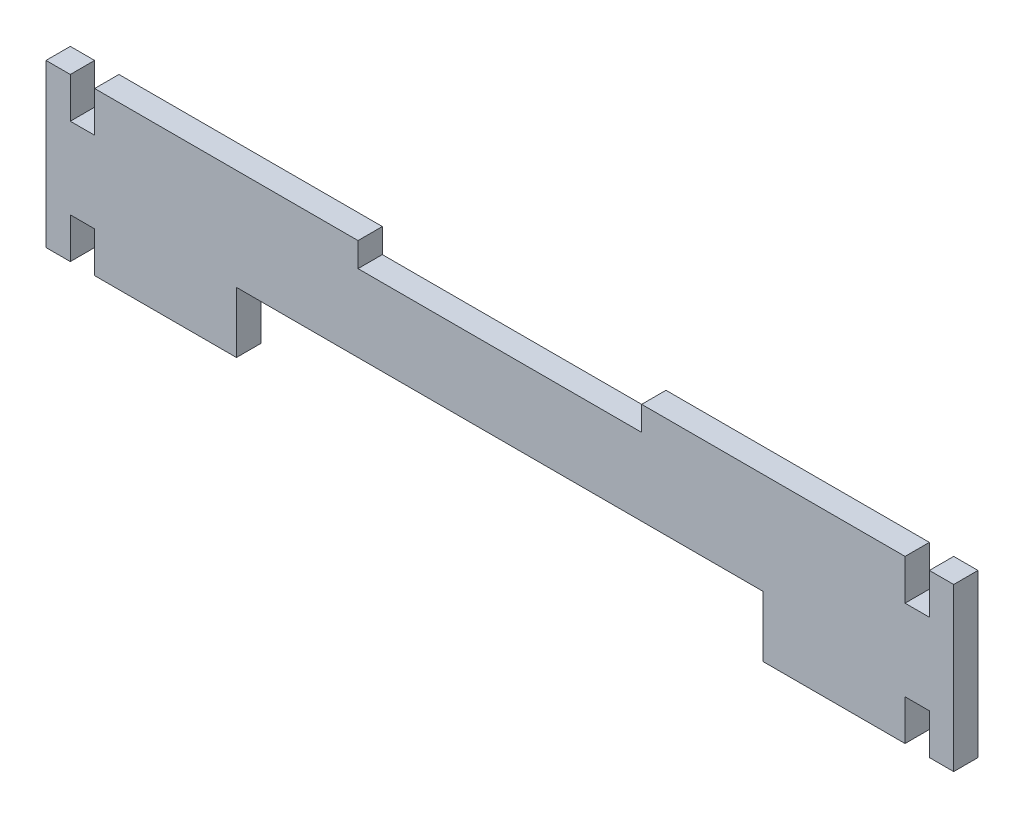
ISO-10303-21;
HEADER;
FILE_DESCRIPTION(('STEP AP214'),'2;1');
FILE_NAME('part.step','',(''),(''),'','','');
FILE_SCHEMA(('AUTOMOTIVE_DESIGN { 1 0 10303 214 1 1 1 1 }'));
ENDSEC;
DATA;
#1=APPLICATION_CONTEXT('core data for automotive mechanical design processes');
#2=APPLICATION_PROTOCOL_DEFINITION('international standard','automotive_design',2000,#1);
#3=PRODUCT_CONTEXT('',#1,'mechanical');
#4=PRODUCT('Part','Part','',(#3));
#5=PRODUCT_RELATED_PRODUCT_CATEGORY('part','',(#4));
#6=PRODUCT_DEFINITION_FORMATION('','',#4);
#7=PRODUCT_DEFINITION_CONTEXT('part definition',#1,'design');
#8=PRODUCT_DEFINITION('design','',#6,#7);
#9=PRODUCT_DEFINITION_SHAPE('','',#8);
#10=(LENGTH_UNIT() NAMED_UNIT(*) SI_UNIT(.MILLI.,.METRE.));
#11=(NAMED_UNIT(*) PLANE_ANGLE_UNIT() SI_UNIT($,.RADIAN.));
#12=(NAMED_UNIT(*) SI_UNIT($,.STERADIAN.) SOLID_ANGLE_UNIT());
#13=UNCERTAINTY_MEASURE_WITH_UNIT(LENGTH_MEASURE(1.E-05),#10,'distance_accuracy_value','');
#14=(GEOMETRIC_REPRESENTATION_CONTEXT(3) GLOBAL_UNCERTAINTY_ASSIGNED_CONTEXT((#13)) GLOBAL_UNIT_ASSIGNED_CONTEXT((#10,
#11,#12)) REPRESENTATION_CONTEXT('',''));
#15=CARTESIAN_POINT('',(0.,0.,0.));
#16=DIRECTION('',(0.,0.,1.));
#17=DIRECTION('',(1.,0.,0.));
#18=AXIS2_PLACEMENT_3D('',#15,#16,#17);
#19=CARTESIAN_POINT('',(0.,0.,6.));
#20=DIRECTION('',(0.,1.,0.));
#21=DIRECTION('',(-1.,0.,0.));
#22=AXIS2_PLACEMENT_3D('',#19,#20,#21);
#23=PLANE('',#22);
#24=DIRECTION('',(1.,0.,0.));
#25=VECTOR('',#24,1.);
#26=CARTESIAN_POINT('',(0.,0.,0.));
#27=LINE('',#26,#25);
#28=CARTESIAN_POINT('',(-212.,0.,0.));
#29=VERTEX_POINT('',#28);
#30=CARTESIAN_POINT('',(-177.,0.,0.));
#31=VERTEX_POINT('',#30);
#32=EDGE_CURVE('E249',#29,#31,#27,.T.);
#33=ORIENTED_EDGE('',*,*,#32,.T.);
#34=DIRECTION('',(0.,0.,1.));
#35=VECTOR('',#34,1.);
#36=CARTESIAN_POINT('',(-177.,0.,-4.));
#37=LINE('',#36,#35);
#38=CARTESIAN_POINT('',(-177.,0.,6.));
#39=VERTEX_POINT('',#38);
#40=EDGE_CURVE('E233',#31,#39,#37,.T.);
#41=ORIENTED_EDGE('',*,*,#40,.T.);
#42=DIRECTION('',(1.,0.,0.));
#43=VECTOR('',#42,1.);
#44=CARTESIAN_POINT('',(0.,0.,6.));
#45=LINE('',#44,#43);
#46=CARTESIAN_POINT('',(-212.,0.,6.));
#47=VERTEX_POINT('',#46);
#48=EDGE_CURVE('E247',#47,#39,#45,.T.);
#49=ORIENTED_EDGE('',*,*,#48,.F.);
#50=DIRECTION('',(0.,0.,1.));
#51=VECTOR('',#50,1.);
#52=CARTESIAN_POINT('',(-212.,0.,0.));
#53=LINE('',#52,#51);
#54=EDGE_CURVE('E409',#29,#47,#53,.T.);
#55=ORIENTED_EDGE('',*,*,#54,.F.);
#56=EDGE_LOOP('',(#33,#41,#49,#55));
#57=FACE_BOUND('',#56,.T.);
#58=ADVANCED_FACE('F45',(#57),#23,.F.);
#59=CARTESIAN_POINT('',(0.,40.,6.));
#60=DIRECTION('',(0.,-1.,0.));
#61=DIRECTION('',(1.,0.,0.));
#62=AXIS2_PLACEMENT_3D('',#59,#60,#61);
#63=PLANE('',#62);
#64=DIRECTION('',(-1.,0.,0.));
#65=VECTOR('',#64,1.);
#66=CARTESIAN_POINT('',(0.,40.,6.));
#67=LINE('',#66,#65);
#68=CARTESIAN_POINT('',(-147.,40.,6.));
#69=VERTEX_POINT('',#68);
#70=CARTESIAN_POINT('',(-212.,40.,6.));
#71=VERTEX_POINT('',#70);
#72=EDGE_CURVE('E284',#69,#71,#67,.T.);
#73=ORIENTED_EDGE('',*,*,#72,.F.);
#74=DIRECTION('',(0.,0.,1.));
#75=VECTOR('',#74,1.);
#76=CARTESIAN_POINT('',(-147.,40.,0.));
#77=LINE('',#76,#75);
#78=CARTESIAN_POINT('',(-147.,40.,0.));
#79=VERTEX_POINT('',#78);
#80=EDGE_CURVE('E358',#79,#69,#77,.T.);
#81=ORIENTED_EDGE('',*,*,#80,.F.);
#82=DIRECTION('',(-1.,0.,0.));
#83=VECTOR('',#82,1.);
#84=CARTESIAN_POINT('',(0.,40.,0.));
#85=LINE('',#84,#83);
#86=CARTESIAN_POINT('',(-212.,40.,0.));
#87=VERTEX_POINT('',#86);
#88=EDGE_CURVE('E522',#79,#87,#85,.T.);
#89=ORIENTED_EDGE('',*,*,#88,.T.);
#90=DIRECTION('',(0.,0.,1.));
#91=VECTOR('',#90,1.);
#92=CARTESIAN_POINT('',(-212.,40.,0.));
#93=LINE('',#92,#91);
#94=EDGE_CURVE('E298',#87,#71,#93,.T.);
#95=ORIENTED_EDGE('',*,*,#94,.T.);
#96=EDGE_LOOP('',(#73,#81,#89,#95));
#97=FACE_BOUND('',#96,.T.);
#98=ADVANCED_FACE('F609',(#97),#63,.F.);
#99=CARTESIAN_POINT('',(-12.,40.,0.));
#100=VERTEX_POINT('',#99);
#101=CARTESIAN_POINT('',(-77.,40.,0.));
#102=VERTEX_POINT('',#101);
#103=EDGE_CURVE('E521',#100,#102,#85,.T.);
#104=ORIENTED_EDGE('',*,*,#103,.T.);
#105=DIRECTION('',(0.,0.,1.));
#106=VECTOR('',#105,1.);
#107=CARTESIAN_POINT('',(-77.,40.,0.));
#108=LINE('',#107,#106);
#109=CARTESIAN_POINT('',(-77.,40.,6.));
#110=VERTEX_POINT('',#109);
#111=EDGE_CURVE('E443',#102,#110,#108,.T.);
#112=ORIENTED_EDGE('',*,*,#111,.T.);
#113=CARTESIAN_POINT('',(-12.,40.,6.));
#114=VERTEX_POINT('',#113);
#115=EDGE_CURVE('E282',#114,#110,#67,.T.);
#116=ORIENTED_EDGE('',*,*,#115,.F.);
#117=DIRECTION('',(0.,0.,1.));
#118=VECTOR('',#117,1.);
#119=CARTESIAN_POINT('',(-12.,40.,0.));
#120=LINE('',#119,#118);
#121=EDGE_CURVE('E380',#100,#114,#120,.T.);
#122=ORIENTED_EDGE('',*,*,#121,.F.);
#123=EDGE_LOOP('',(#104,#112,#116,#122));
#124=FACE_BOUND('',#123,.T.);
#125=ADVANCED_FACE('F540',(#124),#63,.F.);
#126=CARTESIAN_POINT('',(-224.,0.,0.));
#127=VERTEX_POINT('',#126);
#128=CARTESIAN_POINT('',(-218.,0.,0.));
#129=VERTEX_POINT('',#128);
#130=EDGE_CURVE('E290',#127,#129,#27,.T.);
#131=ORIENTED_EDGE('',*,*,#130,.T.);
#132=DIRECTION('',(0.,0.,1.));
#133=VECTOR('',#132,1.);
#134=CARTESIAN_POINT('',(-218.,0.,0.));
#135=LINE('',#134,#133);
#136=CARTESIAN_POINT('',(-218.,0.,6.));
#137=VERTEX_POINT('',#136);
#138=EDGE_CURVE('E405',#129,#137,#135,.T.);
#139=ORIENTED_EDGE('',*,*,#138,.T.);
#140=CARTESIAN_POINT('',(-224.,0.,6.));
#141=VERTEX_POINT('',#140);
#142=EDGE_CURVE('E260',#141,#137,#45,.T.);
#143=ORIENTED_EDGE('',*,*,#142,.F.);
#144=DIRECTION('',(0.,0.,-1.));
#145=VECTOR('',#144,1.);
#146=CARTESIAN_POINT('',(-224.,0.,6.));
#147=LINE('',#146,#145);
#148=EDGE_CURVE('E504',#141,#127,#147,.T.);
#149=ORIENTED_EDGE('',*,*,#148,.T.);
#150=EDGE_LOOP('',(#131,#139,#143,#149));
#151=FACE_BOUND('',#150,.T.);
#152=ADVANCED_FACE('F566',(#151),#23,.F.);
#153=CARTESIAN_POINT('',(-47.,0.,6.));
#154=VERTEX_POINT('',#153);
#155=CARTESIAN_POINT('',(-12.,0.,6.));
#156=VERTEX_POINT('',#155);
#157=EDGE_CURVE('E261',#154,#156,#45,.T.);
#158=ORIENTED_EDGE('',*,*,#157,.F.);
#159=DIRECTION('',(0.,0.,1.));
#160=VECTOR('',#159,1.);
#161=CARTESIAN_POINT('',(-47.,0.,-4.));
#162=LINE('',#161,#160);
#163=CARTESIAN_POINT('',(-47.,0.,0.));
#164=VERTEX_POINT('',#163);
#165=EDGE_CURVE('E251',#164,#154,#162,.T.);
#166=ORIENTED_EDGE('',*,*,#165,.F.);
#167=CARTESIAN_POINT('',(-12.,0.,0.));
#168=VERTEX_POINT('',#167);
#169=EDGE_CURVE('E492',#164,#168,#27,.T.);
#170=ORIENTED_EDGE('',*,*,#169,.T.);
#171=DIRECTION('',(0.,0.,1.));
#172=VECTOR('',#171,1.);
#173=CARTESIAN_POINT('',(-12.,0.,0.));
#174=LINE('',#173,#172);
#175=EDGE_CURVE('E330',#168,#156,#174,.T.);
#176=ORIENTED_EDGE('',*,*,#175,.T.);
#177=EDGE_LOOP('',(#158,#166,#170,#176));
#178=FACE_BOUND('',#177,.T.);
#179=ADVANCED_FACE('F618',(#178),#23,.F.);
#180=CARTESIAN_POINT('',(-218.,40.,6.));
#181=VERTEX_POINT('',#180);
#182=CARTESIAN_POINT('',(-224.,40.,6.));
#183=VERTEX_POINT('',#182);
#184=EDGE_CURVE('E285',#181,#183,#67,.T.);
#185=ORIENTED_EDGE('',*,*,#184,.F.);
#186=DIRECTION('',(0.,0.,1.));
#187=VECTOR('',#186,1.);
#188=CARTESIAN_POINT('',(-218.,40.,0.));
#189=LINE('',#188,#187);
#190=CARTESIAN_POINT('',(-218.,40.,0.));
#191=VERTEX_POINT('',#190);
#192=EDGE_CURVE('E302',#191,#181,#189,.T.);
#193=ORIENTED_EDGE('',*,*,#192,.F.);
#194=CARTESIAN_POINT('',(-224.,40.,0.));
#195=VERTEX_POINT('',#194);
#196=EDGE_CURVE('E523',#191,#195,#85,.T.);
#197=ORIENTED_EDGE('',*,*,#196,.T.);
#198=DIRECTION('',(0.,0.,-1.));
#199=VECTOR('',#198,1.);
#200=CARTESIAN_POINT('',(-224.,40.,6.));
#201=LINE('',#200,#199);
#202=EDGE_CURVE('E498',#183,#195,#201,.T.);
#203=ORIENTED_EDGE('',*,*,#202,.F.);
#204=EDGE_LOOP('',(#185,#193,#197,#203));
#205=FACE_BOUND('',#204,.T.);
#206=ADVANCED_FACE('F559',(#205),#63,.F.);
#207=CARTESIAN_POINT('',(0.,0.,6.));
#208=DIRECTION('',(-1.,0.,0.));
#209=DIRECTION('',(0.,0.,1.));
#210=AXIS2_PLACEMENT_3D('',#207,#208,#209);
#211=PLANE('',#210);
#212=DIRECTION('',(0.,1.,0.));
#213=VECTOR('',#212,1.);
#214=CARTESIAN_POINT('',(0.,0.,0.));
#215=LINE('',#214,#213);
#216=CARTESIAN_POINT('',(0.,0.,0.));
#217=VERTEX_POINT('',#216);
#218=CARTESIAN_POINT('',(0.,40.,0.));
#219=VERTEX_POINT('',#218);
#220=EDGE_CURVE('E305',#217,#219,#215,.T.);
#221=ORIENTED_EDGE('',*,*,#220,.T.);
#222=DIRECTION('',(0.,0.,-1.));
#223=VECTOR('',#222,1.);
#224=CARTESIAN_POINT('',(0.,40.,6.));
#225=LINE('',#224,#223);
#226=CARTESIAN_POINT('',(0.,40.,6.));
#227=VERTEX_POINT('',#226);
#228=EDGE_CURVE('E494',#227,#219,#225,.T.);
#229=ORIENTED_EDGE('',*,*,#228,.F.);
#230=DIRECTION('',(0.,1.,0.));
#231=VECTOR('',#230,1.);
#232=CARTESIAN_POINT('',(0.,0.,6.));
#233=LINE('',#232,#231);
#234=CARTESIAN_POINT('',(0.,0.,6.));
#235=VERTEX_POINT('',#234);
#236=EDGE_CURVE('E287',#235,#227,#233,.T.);
#237=ORIENTED_EDGE('',*,*,#236,.F.);
#238=DIRECTION('',(0.,0.,-1.));
#239=VECTOR('',#238,1.);
#240=CARTESIAN_POINT('',(0.,0.,6.));
#241=LINE('',#240,#239);
#242=EDGE_CURVE('E267',#235,#217,#241,.T.);
#243=ORIENTED_EDGE('',*,*,#242,.T.);
#244=EDGE_LOOP('',(#221,#229,#237,#243));
#245=FACE_BOUND('',#244,.T.);
#246=ADVANCED_FACE('F47',(#245),#211,.F.);
#247=CARTESIAN_POINT('',(-6.00000000000001,40.,0.));
#248=VERTEX_POINT('',#247);
#249=EDGE_CURVE('E518',#219,#248,#85,.T.);
#250=ORIENTED_EDGE('',*,*,#249,.T.);
#251=DIRECTION('',(0.,0.,1.));
#252=VECTOR('',#251,1.);
#253=CARTESIAN_POINT('',(-6.00000000000001,40.,0.));
#254=LINE('',#253,#252);
#255=CARTESIAN_POINT('',(-6.00000000000001,40.,6.));
#256=VERTEX_POINT('',#255);
#257=EDGE_CURVE('E376',#248,#256,#254,.T.);
#258=ORIENTED_EDGE('',*,*,#257,.T.);
#259=EDGE_CURVE('E277',#227,#256,#67,.T.);
#260=ORIENTED_EDGE('',*,*,#259,.F.);
#261=ORIENTED_EDGE('',*,*,#228,.T.);
#262=EDGE_LOOP('',(#250,#258,#260,#261));
#263=FACE_BOUND('',#262,.T.);
#264=ADVANCED_FACE('F585',(#263),#63,.F.);
#265=CARTESIAN_POINT('',(-224.,0.,6.));
#266=DIRECTION('',(1.,0.,0.));
#267=DIRECTION('',(0.,0.,-1.));
#268=AXIS2_PLACEMENT_3D('',#265,#266,#267);
#269=PLANE('',#268);
#270=DIRECTION('',(0.,-1.,0.));
#271=VECTOR('',#270,1.);
#272=CARTESIAN_POINT('',(-224.,0.,0.));
#273=LINE('',#272,#271);
#274=EDGE_CURVE('E514',#195,#127,#273,.T.);
#275=ORIENTED_EDGE('',*,*,#274,.T.);
#276=ORIENTED_EDGE('',*,*,#148,.F.);
#277=DIRECTION('',(0.,-1.,0.));
#278=VECTOR('',#277,1.);
#279=CARTESIAN_POINT('',(-224.,0.,6.));
#280=LINE('',#279,#278);
#281=EDGE_CURVE('E271',#183,#141,#280,.T.);
#282=ORIENTED_EDGE('',*,*,#281,.F.);
#283=ORIENTED_EDGE('',*,*,#202,.T.);
#284=EDGE_LOOP('',(#275,#276,#282,#283));
#285=FACE_BOUND('',#284,.T.);
#286=ADVANCED_FACE('F562',(#285),#269,.F.);
#287=CARTESIAN_POINT('',(-6.00000000000001,0.,6.));
#288=VERTEX_POINT('',#287);
#289=EDGE_CURVE('E263',#288,#235,#45,.T.);
#290=ORIENTED_EDGE('',*,*,#289,.F.);
#291=DIRECTION('',(0.,0.,1.));
#292=VECTOR('',#291,1.);
#293=CARTESIAN_POINT('',(-6.00000000000001,0.,0.));
#294=LINE('',#293,#292);
#295=CARTESIAN_POINT('',(-6.00000000000001,0.,0.));
#296=VERTEX_POINT('',#295);
#297=EDGE_CURVE('E334',#296,#288,#294,.T.);
#298=ORIENTED_EDGE('',*,*,#297,.F.);
#299=EDGE_CURVE('E517',#296,#217,#27,.T.);
#300=ORIENTED_EDGE('',*,*,#299,.T.);
#301=ORIENTED_EDGE('',*,*,#242,.F.);
#302=EDGE_LOOP('',(#290,#298,#300,#301));
#303=FACE_BOUND('',#302,.T.);
#304=ADVANCED_FACE('F582',(#303),#23,.F.);
#305=CARTESIAN_POINT('',(0.,0.,6.));
#306=DIRECTION('',(0.,0.,1.));
#307=DIRECTION('',(1.,0.,0.));
#308=AXIS2_PLACEMENT_3D('',#305,#306,#307);
#309=PLANE('',#308);
#310=DIRECTION('',(0.,-1.,0.));
#311=VECTOR('',#310,1.);
#312=CARTESIAN_POINT('',(-177.,0.,6.));
#313=LINE('',#312,#311);
#314=CARTESIAN_POINT('',(-177.,15.,6.));
#315=VERTEX_POINT('',#314);
#316=EDGE_CURVE('E230',#315,#39,#313,.T.);
#317=ORIENTED_EDGE('',*,*,#316,.F.);
#318=DIRECTION('',(-1.,0.,0.));
#319=VECTOR('',#318,1.);
#320=CARTESIAN_POINT('',(-177.,15.,6.));
#321=LINE('',#320,#319);
#322=CARTESIAN_POINT('',(-47.,15.,6.));
#323=VERTEX_POINT('',#322);
#324=EDGE_CURVE('E252',#323,#315,#321,.T.);
#325=ORIENTED_EDGE('',*,*,#324,.F.);
#326=DIRECTION('',(0.,1.,0.));
#327=VECTOR('',#326,1.);
#328=CARTESIAN_POINT('',(-47.,0.,6.));
#329=LINE('',#328,#327);
#330=EDGE_CURVE('E241',#154,#323,#329,.T.);
#331=ORIENTED_EDGE('',*,*,#330,.F.);
#332=ORIENTED_EDGE('',*,*,#157,.T.);
#333=DIRECTION('',(0.,-1.,0.));
#334=VECTOR('',#333,1.);
#335=CARTESIAN_POINT('',(-12.,10.,6.));
#336=LINE('',#335,#334);
#337=CARTESIAN_POINT('',(-12.,10.,6.));
#338=VERTEX_POINT('',#337);
#339=EDGE_CURVE('E354',#338,#156,#336,.T.);
#340=ORIENTED_EDGE('',*,*,#339,.F.);
#341=DIRECTION('',(-1.,0.,0.));
#342=VECTOR('',#341,1.);
#343=CARTESIAN_POINT('',(-12.,10.,6.));
#344=LINE('',#343,#342);
#345=CARTESIAN_POINT('',(-6.00000000000001,10.,6.));
#346=VERTEX_POINT('',#345);
#347=EDGE_CURVE('E345',#346,#338,#344,.T.);
#348=ORIENTED_EDGE('',*,*,#347,.F.);
#349=DIRECTION('',(0.,1.,0.));
#350=VECTOR('',#349,1.);
#351=CARTESIAN_POINT('',(-6.00000000000001,10.,6.));
#352=LINE('',#351,#350);
#353=EDGE_CURVE('E350',#288,#346,#352,.T.);
#354=ORIENTED_EDGE('',*,*,#353,.F.);
#355=ORIENTED_EDGE('',*,*,#289,.T.);
#356=ORIENTED_EDGE('',*,*,#236,.T.);
#357=ORIENTED_EDGE('',*,*,#259,.T.);
#358=DIRECTION('',(0.,1.,0.));
#359=VECTOR('',#358,1.);
#360=CARTESIAN_POINT('',(-6.00000000000001,40.,6.));
#361=LINE('',#360,#359);
#362=CARTESIAN_POINT('',(-6.00000000000001,30.,6.));
#363=VERTEX_POINT('',#362);
#364=EDGE_CURVE('E384',#363,#256,#361,.T.);
#365=ORIENTED_EDGE('',*,*,#364,.F.);
#366=DIRECTION('',(1.,0.,0.));
#367=VECTOR('',#366,1.);
#368=CARTESIAN_POINT('',(-12.,30.,6.));
#369=LINE('',#368,#367);
#370=CARTESIAN_POINT('',(-12.,30.,6.));
#371=VERTEX_POINT('',#370);
#372=EDGE_CURVE('E388',#371,#363,#369,.T.);
#373=ORIENTED_EDGE('',*,*,#372,.F.);
#374=DIRECTION('',(0.,-1.,0.));
#375=VECTOR('',#374,1.);
#376=CARTESIAN_POINT('',(-12.,40.,6.));
#377=LINE('',#376,#375);
#378=EDGE_CURVE('E344',#114,#371,#377,.T.);
#379=ORIENTED_EDGE('',*,*,#378,.F.);
#380=ORIENTED_EDGE('',*,*,#115,.T.);
#381=DIRECTION('',(0.,1.,0.));
#382=VECTOR('',#381,1.);
#383=CARTESIAN_POINT('',(-77.,40.,6.));
#384=LINE('',#383,#382);
#385=CARTESIAN_POINT('',(-77.,34.,6.));
#386=VERTEX_POINT('',#385);
#387=EDGE_CURVE('E449',#386,#110,#384,.T.);
#388=ORIENTED_EDGE('',*,*,#387,.F.);
#389=DIRECTION('',(1.,0.,0.));
#390=VECTOR('',#389,1.);
#391=CARTESIAN_POINT('',(-147.,34.,6.));
#392=LINE('',#391,#390);
#393=CARTESIAN_POINT('',(-147.,34.,6.));
#394=VERTEX_POINT('',#393);
#395=EDGE_CURVE('E453',#394,#386,#392,.T.);
#396=ORIENTED_EDGE('',*,*,#395,.F.);
#397=DIRECTION('',(0.,-1.,0.));
#398=VECTOR('',#397,1.);
#399=CARTESIAN_POINT('',(-147.,40.,6.));
#400=LINE('',#399,#398);
#401=EDGE_CURVE('E457',#69,#394,#400,.T.);
#402=ORIENTED_EDGE('',*,*,#401,.F.);
#403=ORIENTED_EDGE('',*,*,#72,.T.);
#404=DIRECTION('',(0.,1.,0.));
#405=VECTOR('',#404,1.);
#406=CARTESIAN_POINT('',(-212.,40.,6.));
#407=LINE('',#406,#405);
#408=CARTESIAN_POINT('',(-212.,30.,6.));
#409=VERTEX_POINT('',#408);
#410=EDGE_CURVE('E306',#409,#71,#407,.T.);
#411=ORIENTED_EDGE('',*,*,#410,.F.);
#412=DIRECTION('',(1.,0.,0.));
#413=VECTOR('',#412,1.);
#414=CARTESIAN_POINT('',(-218.,30.,6.));
#415=LINE('',#414,#413);
#416=CARTESIAN_POINT('',(-218.,30.,6.));
#417=VERTEX_POINT('',#416);
#418=EDGE_CURVE('E311',#417,#409,#415,.T.);
#419=ORIENTED_EDGE('',*,*,#418,.F.);
#420=DIRECTION('',(0.,-1.,0.));
#421=VECTOR('',#420,1.);
#422=CARTESIAN_POINT('',(-218.,40.,6.));
#423=LINE('',#422,#421);
#424=EDGE_CURVE('E315',#181,#417,#423,.T.);
#425=ORIENTED_EDGE('',*,*,#424,.F.);
#426=ORIENTED_EDGE('',*,*,#184,.T.);
#427=ORIENTED_EDGE('',*,*,#281,.T.);
#428=ORIENTED_EDGE('',*,*,#142,.T.);
#429=DIRECTION('',(0.,-1.,0.));
#430=VECTOR('',#429,1.);
#431=CARTESIAN_POINT('',(-218.,10.,6.));
#432=LINE('',#431,#430);
#433=CARTESIAN_POINT('',(-218.,10.,6.));
#434=VERTEX_POINT('',#433);
#435=EDGE_CURVE('E383',#434,#137,#432,.T.);
#436=ORIENTED_EDGE('',*,*,#435,.F.);
#437=DIRECTION('',(-1.,0.,0.));
#438=VECTOR('',#437,1.);
#439=CARTESIAN_POINT('',(-218.,10.,6.));
#440=LINE('',#439,#438);
#441=CARTESIAN_POINT('',(-212.,10.,6.));
#442=VERTEX_POINT('',#441);
#443=EDGE_CURVE('E418',#442,#434,#440,.T.);
#444=ORIENTED_EDGE('',*,*,#443,.F.);
#445=DIRECTION('',(0.,1.,0.));
#446=VECTOR('',#445,1.);
#447=CARTESIAN_POINT('',(-212.,10.,6.));
#448=LINE('',#447,#446);
#449=EDGE_CURVE('E258',#47,#442,#448,.T.);
#450=ORIENTED_EDGE('',*,*,#449,.F.);
#451=ORIENTED_EDGE('',*,*,#48,.T.);
#452=EDGE_LOOP('',(#317,#325,#331,#332,#340,#348,#354,#355,#356,#357,#365,#373,#379,#380,#388,
#396,#402,#403,#411,#419,#425,#426,#427,#428,#436,#444,#450,#451));
#453=FACE_BOUND('',#452,.T.);
#454=ADVANCED_FACE('F255',(#453),#309,.T.);
#455=CARTESIAN_POINT('',(0.,0.,0.));
#456=DIRECTION('',(0.,0.,1.));
#457=DIRECTION('',(1.,0.,0.));
#458=AXIS2_PLACEMENT_3D('',#455,#456,#457);
#459=PLANE('',#458);
#460=DIRECTION('',(-1.,0.,0.));
#461=VECTOR('',#460,1.);
#462=CARTESIAN_POINT('',(0.,15.,0.));
#463=LINE('',#462,#461);
#464=CARTESIAN_POINT('',(-47.,15.,0.));
#465=VERTEX_POINT('',#464);
#466=CARTESIAN_POINT('',(-177.,15.,0.));
#467=VERTEX_POINT('',#466);
#468=EDGE_CURVE('E54',#465,#467,#463,.T.);
#469=ORIENTED_EDGE('',*,*,#468,.T.);
#470=DIRECTION('',(0.,-1.,0.));
#471=VECTOR('',#470,1.);
#472=CARTESIAN_POINT('',(-177.,0.,0.));
#473=LINE('',#472,#471);
#474=EDGE_CURVE('E11',#467,#31,#473,.T.);
#475=ORIENTED_EDGE('',*,*,#474,.T.);
#476=ORIENTED_EDGE('',*,*,#32,.F.);
#477=DIRECTION('',(0.,1.,0.));
#478=VECTOR('',#477,1.);
#479=CARTESIAN_POINT('',(-212.,10.,0.));
#480=LINE('',#479,#478);
#481=CARTESIAN_POINT('',(-212.,10.,0.));
#482=VERTEX_POINT('',#481);
#483=EDGE_CURVE('E430',#29,#482,#480,.T.);
#484=ORIENTED_EDGE('',*,*,#483,.T.);
#485=DIRECTION('',(-1.,0.,0.));
#486=VECTOR('',#485,1.);
#487=CARTESIAN_POINT('',(-218.,10.,0.));
#488=LINE('',#487,#486);
#489=CARTESIAN_POINT('',(-218.,10.,0.));
#490=VERTEX_POINT('',#489);
#491=EDGE_CURVE('E410',#482,#490,#488,.T.);
#492=ORIENTED_EDGE('',*,*,#491,.T.);
#493=DIRECTION('',(0.,-1.,0.));
#494=VECTOR('',#493,1.);
#495=CARTESIAN_POINT('',(-218.,10.,0.));
#496=LINE('',#495,#494);
#497=EDGE_CURVE('E422',#490,#129,#496,.T.);
#498=ORIENTED_EDGE('',*,*,#497,.T.);
#499=ORIENTED_EDGE('',*,*,#130,.F.);
#500=ORIENTED_EDGE('',*,*,#274,.F.);
#501=ORIENTED_EDGE('',*,*,#196,.F.);
#502=DIRECTION('',(0.,-1.,0.));
#503=VECTOR('',#502,1.);
#504=CARTESIAN_POINT('',(-218.,40.,0.));
#505=LINE('',#504,#503);
#506=CARTESIAN_POINT('',(-218.,30.,0.));
#507=VERTEX_POINT('',#506);
#508=EDGE_CURVE('E310',#191,#507,#505,.T.);
#509=ORIENTED_EDGE('',*,*,#508,.T.);
#510=DIRECTION('',(1.,0.,0.));
#511=VECTOR('',#510,1.);
#512=CARTESIAN_POINT('',(-218.,30.,0.));
#513=LINE('',#512,#511);
#514=CARTESIAN_POINT('',(-212.,30.,0.));
#515=VERTEX_POINT('',#514);
#516=EDGE_CURVE('E323',#507,#515,#513,.T.);
#517=ORIENTED_EDGE('',*,*,#516,.T.);
#518=DIRECTION('',(0.,1.,0.));
#519=VECTOR('',#518,1.);
#520=CARTESIAN_POINT('',(-212.,40.,0.));
#521=LINE('',#520,#519);
#522=EDGE_CURVE('E295',#515,#87,#521,.T.);
#523=ORIENTED_EDGE('',*,*,#522,.T.);
#524=ORIENTED_EDGE('',*,*,#88,.F.);
#525=DIRECTION('',(0.,-1.,0.));
#526=VECTOR('',#525,1.);
#527=CARTESIAN_POINT('',(-147.,40.,0.));
#528=LINE('',#527,#526);
#529=CARTESIAN_POINT('',(-147.,34.,0.));
#530=VERTEX_POINT('',#529);
#531=EDGE_CURVE('E452',#79,#530,#528,.T.);
#532=ORIENTED_EDGE('',*,*,#531,.T.);
#533=DIRECTION('',(1.,0.,0.));
#534=VECTOR('',#533,1.);
#535=CARTESIAN_POINT('',(-147.,34.,0.));
#536=LINE('',#535,#534);
#537=CARTESIAN_POINT('',(-77.,34.,0.));
#538=VERTEX_POINT('',#537);
#539=EDGE_CURVE('E463',#530,#538,#536,.T.);
#540=ORIENTED_EDGE('',*,*,#539,.T.);
#541=DIRECTION('',(0.,1.,0.));
#542=VECTOR('',#541,1.);
#543=CARTESIAN_POINT('',(-77.,40.,0.));
#544=LINE('',#543,#542);
#545=EDGE_CURVE('E69',#538,#102,#544,.T.);
#546=ORIENTED_EDGE('',*,*,#545,.T.);
#547=ORIENTED_EDGE('',*,*,#103,.F.);
#548=DIRECTION('',(0.,-1.,0.));
#549=VECTOR('',#548,1.);
#550=CARTESIAN_POINT('',(-12.,40.,0.));
#551=LINE('',#550,#549);
#552=CARTESIAN_POINT('',(-12.,30.,0.));
#553=VERTEX_POINT('',#552);
#554=EDGE_CURVE('E387',#100,#553,#551,.T.);
#555=ORIENTED_EDGE('',*,*,#554,.T.);
#556=DIRECTION('',(1.,0.,0.));
#557=VECTOR('',#556,1.);
#558=CARTESIAN_POINT('',(-12.,30.,0.));
#559=LINE('',#558,#557);
#560=CARTESIAN_POINT('',(-6.00000000000001,30.,0.));
#561=VERTEX_POINT('',#560);
#562=EDGE_CURVE('E398',#553,#561,#559,.T.);
#563=ORIENTED_EDGE('',*,*,#562,.T.);
#564=DIRECTION('',(0.,1.,0.));
#565=VECTOR('',#564,1.);
#566=CARTESIAN_POINT('',(-6.00000000000001,40.,0.));
#567=LINE('',#566,#565);
#568=EDGE_CURVE('E373',#561,#248,#567,.T.);
#569=ORIENTED_EDGE('',*,*,#568,.T.);
#570=ORIENTED_EDGE('',*,*,#249,.F.);
#571=ORIENTED_EDGE('',*,*,#220,.F.);
#572=ORIENTED_EDGE('',*,*,#299,.F.);
#573=DIRECTION('',(0.,1.,0.));
#574=VECTOR('',#573,1.);
#575=CARTESIAN_POINT('',(-6.00000000000001,10.,0.));
#576=LINE('',#575,#574);
#577=CARTESIAN_POINT('',(-6.00000000000001,10.,0.));
#578=VERTEX_POINT('',#577);
#579=EDGE_CURVE('E362',#296,#578,#576,.T.);
#580=ORIENTED_EDGE('',*,*,#579,.T.);
#581=DIRECTION('',(-1.,0.,0.));
#582=VECTOR('',#581,1.);
#583=CARTESIAN_POINT('',(-12.,10.,0.));
#584=LINE('',#583,#582);
#585=CARTESIAN_POINT('',(-12.,10.,0.));
#586=VERTEX_POINT('',#585);
#587=EDGE_CURVE('E335',#578,#586,#584,.T.);
#588=ORIENTED_EDGE('',*,*,#587,.T.);
#589=DIRECTION('',(0.,-1.,0.));
#590=VECTOR('',#589,1.);
#591=CARTESIAN_POINT('',(-12.,10.,0.));
#592=LINE('',#591,#590);
#593=EDGE_CURVE('E349',#586,#168,#592,.T.);
#594=ORIENTED_EDGE('',*,*,#593,.T.);
#595=ORIENTED_EDGE('',*,*,#169,.F.);
#596=DIRECTION('',(0.,1.,0.));
#597=VECTOR('',#596,1.);
#598=CARTESIAN_POINT('',(-47.,0.,0.));
#599=LINE('',#598,#597);
#600=EDGE_CURVE('E489',#164,#465,#599,.T.);
#601=ORIENTED_EDGE('',*,*,#600,.T.);
#602=EDGE_LOOP('',(#469,#475,#476,#484,#492,#498,#499,#500,#501,#509,#517,#523,#524,#532,#540,
#546,#547,#555,#563,#569,#570,#571,#572,#580,#588,#594,#595,#601));
#603=FACE_BOUND('',#602,.T.);
#604=ADVANCED_FACE('F491',(#603),#459,.F.);
#605=CARTESIAN_POINT('',(-218.,40.,0.));
#606=DIRECTION('',(-1.,0.,0.));
#607=DIRECTION('',(0.,0.,1.));
#608=AXIS2_PLACEMENT_3D('',#605,#606,#607);
#609=PLANE('',#608);
#610=ORIENTED_EDGE('',*,*,#424,.T.);
#611=DIRECTION('',(0.,0.,1.));
#612=VECTOR('',#611,1.);
#613=CARTESIAN_POINT('',(-218.,30.,0.));
#614=LINE('',#613,#612);
#615=EDGE_CURVE('E291',#507,#417,#614,.T.);
#616=ORIENTED_EDGE('',*,*,#615,.F.);
#617=ORIENTED_EDGE('',*,*,#508,.F.);
#618=ORIENTED_EDGE('',*,*,#192,.T.);
#619=EDGE_LOOP('',(#610,#616,#617,#618));
#620=FACE_BOUND('',#619,.T.);
#621=ADVANCED_FACE('F648',(#620),#609,.F.);
#622=CARTESIAN_POINT('',(-212.,40.,0.));
#623=DIRECTION('',(1.,0.,0.));
#624=DIRECTION('',(0.,0.,-1.));
#625=AXIS2_PLACEMENT_3D('',#622,#623,#624);
#626=PLANE('',#625);
#627=ORIENTED_EDGE('',*,*,#410,.T.);
#628=ORIENTED_EDGE('',*,*,#94,.F.);
#629=ORIENTED_EDGE('',*,*,#522,.F.);
#630=DIRECTION('',(0.,0.,1.));
#631=VECTOR('',#630,1.);
#632=CARTESIAN_POINT('',(-212.,30.,0.));
#633=LINE('',#632,#631);
#634=EDGE_CURVE('E294',#515,#409,#633,.T.);
#635=ORIENTED_EDGE('',*,*,#634,.T.);
#636=EDGE_LOOP('',(#627,#628,#629,#635));
#637=FACE_BOUND('',#636,.T.);
#638=ADVANCED_FACE('F645',(#637),#626,.F.);
#639=CARTESIAN_POINT('',(-218.,30.,0.));
#640=DIRECTION('',(0.,-1.,0.));
#641=DIRECTION('',(0.,0.,-1.));
#642=AXIS2_PLACEMENT_3D('',#639,#640,#641);
#643=PLANE('',#642);
#644=ORIENTED_EDGE('',*,*,#418,.T.);
#645=ORIENTED_EDGE('',*,*,#634,.F.);
#646=ORIENTED_EDGE('',*,*,#516,.F.);
#647=ORIENTED_EDGE('',*,*,#615,.T.);
#648=EDGE_LOOP('',(#644,#645,#646,#647));
#649=FACE_BOUND('',#648,.T.);
#650=ADVANCED_FACE('F642',(#649),#643,.F.);
#651=CARTESIAN_POINT('',(-12.,10.,0.));
#652=DIRECTION('',(-1.,0.,0.));
#653=DIRECTION('',(0.,0.,1.));
#654=AXIS2_PLACEMENT_3D('',#651,#652,#653);
#655=PLANE('',#654);
#656=ORIENTED_EDGE('',*,*,#339,.T.);
#657=ORIENTED_EDGE('',*,*,#175,.F.);
#658=ORIENTED_EDGE('',*,*,#593,.F.);
#659=DIRECTION('',(0.,0.,1.));
#660=VECTOR('',#659,1.);
#661=CARTESIAN_POINT('',(-12.,10.,0.));
#662=LINE('',#661,#660);
#663=EDGE_CURVE('E341',#586,#338,#662,.T.);
#664=ORIENTED_EDGE('',*,*,#663,.T.);
#665=EDGE_LOOP('',(#656,#657,#658,#664));
#666=FACE_BOUND('',#665,.T.);
#667=ADVANCED_FACE('F634',(#666),#655,.F.);
#668=CARTESIAN_POINT('',(-12.,10.,0.));
#669=DIRECTION('',(0.,1.,0.));
#670=DIRECTION('',(0.,0.,1.));
#671=AXIS2_PLACEMENT_3D('',#668,#669,#670);
#672=PLANE('',#671);
#673=ORIENTED_EDGE('',*,*,#347,.T.);
#674=ORIENTED_EDGE('',*,*,#663,.F.);
#675=ORIENTED_EDGE('',*,*,#587,.F.);
#676=DIRECTION('',(0.,0.,1.));
#677=VECTOR('',#676,1.);
#678=CARTESIAN_POINT('',(-6.00000000000001,10.,0.));
#679=LINE('',#678,#677);
#680=EDGE_CURVE('E338',#578,#346,#679,.T.);
#681=ORIENTED_EDGE('',*,*,#680,.T.);
#682=EDGE_LOOP('',(#673,#674,#675,#681));
#683=FACE_BOUND('',#682,.T.);
#684=ADVANCED_FACE('F603',(#683),#672,.F.);
#685=CARTESIAN_POINT('',(-6.00000000000001,10.,0.));
#686=DIRECTION('',(1.,0.,0.));
#687=DIRECTION('',(0.,0.,-1.));
#688=AXIS2_PLACEMENT_3D('',#685,#686,#687);
#689=PLANE('',#688);
#690=ORIENTED_EDGE('',*,*,#353,.T.);
#691=ORIENTED_EDGE('',*,*,#680,.F.);
#692=ORIENTED_EDGE('',*,*,#579,.F.);
#693=ORIENTED_EDGE('',*,*,#297,.T.);
#694=EDGE_LOOP('',(#690,#691,#692,#693));
#695=FACE_BOUND('',#694,.T.);
#696=ADVANCED_FACE('F596',(#695),#689,.F.);
#697=CARTESIAN_POINT('',(-12.,40.,0.));
#698=DIRECTION('',(-1.,0.,0.));
#699=DIRECTION('',(0.,0.,1.));
#700=AXIS2_PLACEMENT_3D('',#697,#698,#699);
#701=PLANE('',#700);
#702=ORIENTED_EDGE('',*,*,#378,.T.);
#703=DIRECTION('',(0.,0.,1.));
#704=VECTOR('',#703,1.);
#705=CARTESIAN_POINT('',(-12.,30.,0.));
#706=LINE('',#705,#704);
#707=EDGE_CURVE('E369',#553,#371,#706,.T.);
#708=ORIENTED_EDGE('',*,*,#707,.F.);
#709=ORIENTED_EDGE('',*,*,#554,.F.);
#710=ORIENTED_EDGE('',*,*,#121,.T.);
#711=EDGE_LOOP('',(#702,#708,#709,#710));
#712=FACE_BOUND('',#711,.T.);
#713=ADVANCED_FACE('F594',(#712),#701,.F.);
#714=CARTESIAN_POINT('',(-6.00000000000001,40.,0.));
#715=DIRECTION('',(1.,0.,0.));
#716=DIRECTION('',(0.,0.,-1.));
#717=AXIS2_PLACEMENT_3D('',#714,#715,#716);
#718=PLANE('',#717);
#719=ORIENTED_EDGE('',*,*,#364,.T.);
#720=ORIENTED_EDGE('',*,*,#257,.F.);
#721=ORIENTED_EDGE('',*,*,#568,.F.);
#722=DIRECTION('',(0.,0.,1.));
#723=VECTOR('',#722,1.);
#724=CARTESIAN_POINT('',(-6.00000000000001,30.,0.));
#725=LINE('',#724,#723);
#726=EDGE_CURVE('E372',#561,#363,#725,.T.);
#727=ORIENTED_EDGE('',*,*,#726,.T.);
#728=EDGE_LOOP('',(#719,#720,#721,#727));
#729=FACE_BOUND('',#728,.T.);
#730=ADVANCED_FACE('F588',(#729),#718,.F.);
#731=CARTESIAN_POINT('',(-12.,30.,0.));
#732=DIRECTION('',(0.,-1.,0.));
#733=DIRECTION('',(0.,0.,-1.));
#734=AXIS2_PLACEMENT_3D('',#731,#732,#733);
#735=PLANE('',#734);
#736=ORIENTED_EDGE('',*,*,#372,.T.);
#737=ORIENTED_EDGE('',*,*,#726,.F.);
#738=ORIENTED_EDGE('',*,*,#562,.F.);
#739=ORIENTED_EDGE('',*,*,#707,.T.);
#740=EDGE_LOOP('',(#736,#737,#738,#739));
#741=FACE_BOUND('',#740,.T.);
#742=ADVANCED_FACE('F592',(#741),#735,.F.);
#743=CARTESIAN_POINT('',(-218.,10.,0.));
#744=DIRECTION('',(-1.,0.,0.));
#745=DIRECTION('',(0.,0.,1.));
#746=AXIS2_PLACEMENT_3D('',#743,#744,#745);
#747=PLANE('',#746);
#748=ORIENTED_EDGE('',*,*,#435,.T.);
#749=ORIENTED_EDGE('',*,*,#138,.F.);
#750=ORIENTED_EDGE('',*,*,#497,.F.);
#751=DIRECTION('',(0.,0.,1.));
#752=VECTOR('',#751,1.);
#753=CARTESIAN_POINT('',(-218.,10.,0.));
#754=LINE('',#753,#752);
#755=EDGE_CURVE('E319',#490,#434,#754,.T.);
#756=ORIENTED_EDGE('',*,*,#755,.T.);
#757=EDGE_LOOP('',(#748,#749,#750,#756));
#758=FACE_BOUND('',#757,.T.);
#759=ADVANCED_FACE('F569',(#758),#747,.F.);
#760=CARTESIAN_POINT('',(-218.,10.,0.));
#761=DIRECTION('',(0.,1.,0.));
#762=DIRECTION('',(0.,0.,1.));
#763=AXIS2_PLACEMENT_3D('',#760,#761,#762);
#764=PLANE('',#763);
#765=ORIENTED_EDGE('',*,*,#443,.T.);
#766=ORIENTED_EDGE('',*,*,#755,.F.);
#767=ORIENTED_EDGE('',*,*,#491,.F.);
#768=DIRECTION('',(0.,0.,1.));
#769=VECTOR('',#768,1.);
#770=CARTESIAN_POINT('',(-212.,10.,0.));
#771=LINE('',#770,#769);
#772=EDGE_CURVE('E413',#482,#442,#771,.T.);
#773=ORIENTED_EDGE('',*,*,#772,.T.);
#774=EDGE_LOOP('',(#765,#766,#767,#773));
#775=FACE_BOUND('',#774,.T.);
#776=ADVANCED_FACE('F572',(#775),#764,.F.);
#777=CARTESIAN_POINT('',(-212.,10.,0.));
#778=DIRECTION('',(1.,0.,0.));
#779=DIRECTION('',(0.,0.,-1.));
#780=AXIS2_PLACEMENT_3D('',#777,#778,#779);
#781=PLANE('',#780);
#782=ORIENTED_EDGE('',*,*,#449,.T.);
#783=ORIENTED_EDGE('',*,*,#772,.F.);
#784=ORIENTED_EDGE('',*,*,#483,.F.);
#785=ORIENTED_EDGE('',*,*,#54,.T.);
#786=EDGE_LOOP('',(#782,#783,#784,#785));
#787=FACE_BOUND('',#786,.T.);
#788=ADVANCED_FACE('F575',(#787),#781,.F.);
#789=CARTESIAN_POINT('',(-147.,40.,0.));
#790=DIRECTION('',(-1.,0.,0.));
#791=DIRECTION('',(0.,0.,1.));
#792=AXIS2_PLACEMENT_3D('',#789,#790,#791);
#793=PLANE('',#792);
#794=ORIENTED_EDGE('',*,*,#401,.T.);
#795=DIRECTION('',(0.,0.,1.));
#796=VECTOR('',#795,1.);
#797=CARTESIAN_POINT('',(-147.,34.,0.));
#798=LINE('',#797,#796);
#799=EDGE_CURVE('E437',#530,#394,#798,.T.);
#800=ORIENTED_EDGE('',*,*,#799,.F.);
#801=ORIENTED_EDGE('',*,*,#531,.F.);
#802=ORIENTED_EDGE('',*,*,#80,.T.);
#803=EDGE_LOOP('',(#794,#800,#801,#802));
#804=FACE_BOUND('',#803,.T.);
#805=ADVANCED_FACE('F743',(#804),#793,.F.);
#806=CARTESIAN_POINT('',(-77.,40.,0.));
#807=DIRECTION('',(1.,0.,0.));
#808=DIRECTION('',(0.,0.,-1.));
#809=AXIS2_PLACEMENT_3D('',#806,#807,#808);
#810=PLANE('',#809);
#811=ORIENTED_EDGE('',*,*,#387,.T.);
#812=ORIENTED_EDGE('',*,*,#111,.F.);
#813=ORIENTED_EDGE('',*,*,#545,.F.);
#814=DIRECTION('',(0.,0.,1.));
#815=VECTOR('',#814,1.);
#816=CARTESIAN_POINT('',(-77.,34.,0.));
#817=LINE('',#816,#815);
#818=EDGE_CURVE('E440',#538,#386,#817,.T.);
#819=ORIENTED_EDGE('',*,*,#818,.T.);
#820=EDGE_LOOP('',(#811,#812,#813,#819));
#821=FACE_BOUND('',#820,.T.);
#822=ADVANCED_FACE('F549',(#821),#810,.F.);
#823=CARTESIAN_POINT('',(-147.,34.,0.));
#824=DIRECTION('',(0.,-1.,0.));
#825=DIRECTION('',(1.,0.,0.));
#826=AXIS2_PLACEMENT_3D('',#823,#824,#825);
#827=PLANE('',#826);
#828=ORIENTED_EDGE('',*,*,#395,.T.);
#829=ORIENTED_EDGE('',*,*,#818,.F.);
#830=ORIENTED_EDGE('',*,*,#539,.F.);
#831=ORIENTED_EDGE('',*,*,#799,.T.);
#832=EDGE_LOOP('',(#828,#829,#830,#831));
#833=FACE_BOUND('',#832,.T.);
#834=ADVANCED_FACE('F546',(#833),#827,.F.);
#835=CARTESIAN_POINT('',(-177.,0.,-4.));
#836=DIRECTION('',(-1.,0.,0.));
#837=DIRECTION('',(0.,0.,1.));
#838=AXIS2_PLACEMENT_3D('',#835,#836,#837);
#839=PLANE('',#838);
#840=DIRECTION('',(0.,0.,1.));
#841=VECTOR('',#840,1.);
#842=CARTESIAN_POINT('',(-177.,15.,-4.));
#843=LINE('',#842,#841);
#844=EDGE_CURVE('E235',#467,#315,#843,.T.);
#845=ORIENTED_EDGE('',*,*,#844,.T.);
#846=ORIENTED_EDGE('',*,*,#316,.T.);
#847=ORIENTED_EDGE('',*,*,#40,.F.);
#848=ORIENTED_EDGE('',*,*,#474,.F.);
#849=EDGE_LOOP('',(#845,#846,#847,#848));
#850=FACE_BOUND('',#849,.T.);
#851=ADVANCED_FACE('F232',(#850),#839,.F.);
#852=CARTESIAN_POINT('',(-177.,15.,-4.));
#853=DIRECTION('',(0.,1.,0.));
#854=DIRECTION('',(-1.,0.,0.));
#855=AXIS2_PLACEMENT_3D('',#852,#853,#854);
#856=PLANE('',#855);
#857=DIRECTION('',(0.,0.,1.));
#858=VECTOR('',#857,1.);
#859=CARTESIAN_POINT('',(-47.,15.,-4.));
#860=LINE('',#859,#858);
#861=EDGE_CURVE('E61',#465,#323,#860,.T.);
#862=ORIENTED_EDGE('',*,*,#861,.T.);
#863=ORIENTED_EDGE('',*,*,#324,.T.);
#864=ORIENTED_EDGE('',*,*,#844,.F.);
#865=ORIENTED_EDGE('',*,*,#468,.F.);
#866=EDGE_LOOP('',(#862,#863,#864,#865));
#867=FACE_BOUND('',#866,.T.);
#868=ADVANCED_FACE('F484',(#867),#856,.F.);
#869=CARTESIAN_POINT('',(-47.,0.,-4.));
#870=DIRECTION('',(1.,0.,0.));
#871=DIRECTION('',(0.,0.,-1.));
#872=AXIS2_PLACEMENT_3D('',#869,#870,#871);
#873=PLANE('',#872);
#874=ORIENTED_EDGE('',*,*,#165,.T.);
#875=ORIENTED_EDGE('',*,*,#330,.T.);
#876=ORIENTED_EDGE('',*,*,#861,.F.);
#877=ORIENTED_EDGE('',*,*,#600,.F.);
#878=EDGE_LOOP('',(#874,#875,#876,#877));
#879=FACE_BOUND('',#878,.T.);
#880=ADVANCED_FACE('F480',(#879),#873,.F.);
#881=CLOSED_SHELL('',(#58,#98,#125,#152,#179,#206,#246,#264,#286,#304,#454,#604,#621,#638,#650,
#667,#684,#696,#713,#730,#742,#759,#776,#788,#805,#822,#834,#851,#868,#880));
#882=MANIFOLD_SOLID_BREP('B2',#881);
#883=ADVANCED_BREP_SHAPE_REPRESENTATION('',(#18,#882),#14);
#884=SHAPE_DEFINITION_REPRESENTATION(#9,#883);
ENDSEC;
END-ISO-10303-21;
